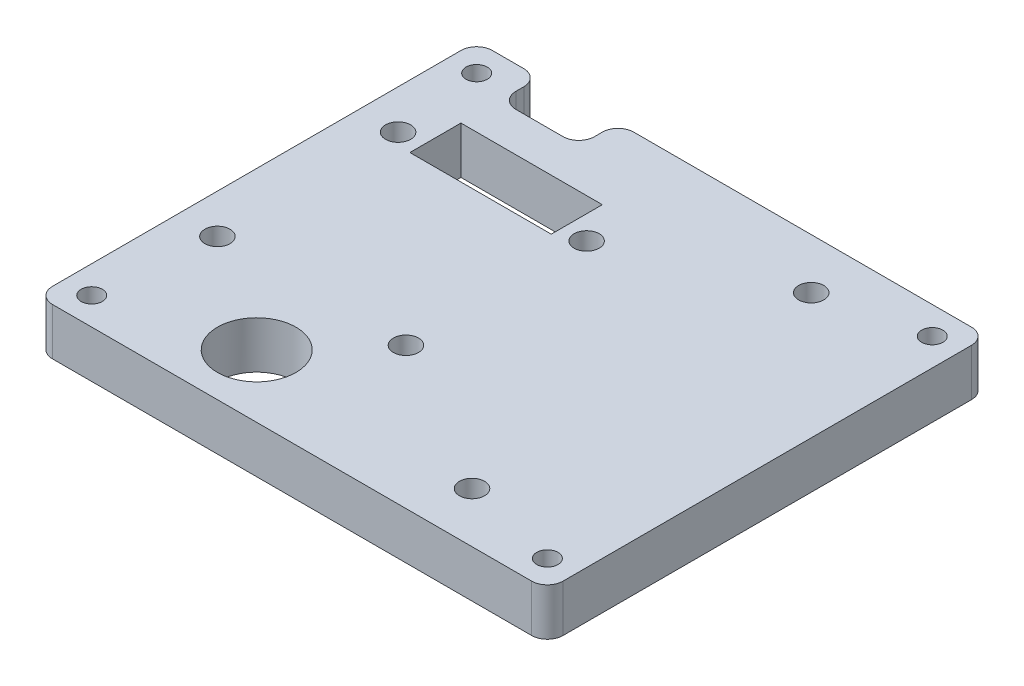
ISO-10303-21;
HEADER;
FILE_DESCRIPTION(('STEP AP214'),'2;1');
FILE_NAME('part.step','',(''),(''),'','','');
FILE_SCHEMA(('AUTOMOTIVE_DESIGN { 1 0 10303 214 1 1 1 1 }'));
ENDSEC;
DATA;
#1=APPLICATION_CONTEXT('core data for automotive mechanical design processes');
#2=APPLICATION_PROTOCOL_DEFINITION('international standard','automotive_design',2000,#1);
#3=PRODUCT_CONTEXT('',#1,'mechanical');
#4=PRODUCT('Part','Part','',(#3));
#5=PRODUCT_RELATED_PRODUCT_CATEGORY('part','',(#4));
#6=PRODUCT_DEFINITION_FORMATION('','',#4);
#7=PRODUCT_DEFINITION_CONTEXT('part definition',#1,'design');
#8=PRODUCT_DEFINITION('design','',#6,#7);
#9=PRODUCT_DEFINITION_SHAPE('','',#8);
#10=(LENGTH_UNIT() NAMED_UNIT(*) SI_UNIT(.MILLI.,.METRE.));
#11=(NAMED_UNIT(*) PLANE_ANGLE_UNIT() SI_UNIT($,.RADIAN.));
#12=(NAMED_UNIT(*) SI_UNIT($,.STERADIAN.) SOLID_ANGLE_UNIT());
#13=UNCERTAINTY_MEASURE_WITH_UNIT(LENGTH_MEASURE(1.E-05),#10,'distance_accuracy_value','');
#14=(GEOMETRIC_REPRESENTATION_CONTEXT(3) GLOBAL_UNCERTAINTY_ASSIGNED_CONTEXT((#13)) GLOBAL_UNIT_ASSIGNED_CONTEXT((#10,
#11,#12)) REPRESENTATION_CONTEXT('',''));
#15=CARTESIAN_POINT('',(0.,0.,0.));
#16=DIRECTION('',(0.,0.,1.));
#17=DIRECTION('',(1.,0.,0.));
#18=AXIS2_PLACEMENT_3D('',#15,#16,#17);
#19=CARTESIAN_POINT('',(-32.5,6.,-28.));
#20=DIRECTION('',(0.,0.,1.));
#21=DIRECTION('',(1.,0.,0.));
#22=AXIS2_PLACEMENT_3D('',#19,#20,#21);
#23=PLANE('',#22);
#24=DIRECTION('',(-1.,0.,0.));
#25=VECTOR('',#24,1.);
#26=CARTESIAN_POINT('',(-32.5,0.,-28.));
#27=LINE('',#26,#25);
#28=CARTESIAN_POINT('',(30.5,0.,-28.));
#29=VERTEX_POINT('',#28);
#30=CARTESIAN_POINT('',(-12.5,0.,-28.));
#31=VERTEX_POINT('',#30);
#32=EDGE_CURVE('E342',#29,#31,#27,.T.);
#33=ORIENTED_EDGE('',*,*,#32,.T.);
#34=DIRECTION('',(0.,1.,0.));
#35=VECTOR('',#34,1.);
#36=CARTESIAN_POINT('',(-12.5,6.,-28.));
#37=LINE('',#36,#35);
#38=CARTESIAN_POINT('',(-12.5,6.,-28.));
#39=VERTEX_POINT('',#38);
#40=EDGE_CURVE('E441',#31,#39,#37,.T.);
#41=ORIENTED_EDGE('',*,*,#40,.T.);
#42=DIRECTION('',(-1.,0.,0.));
#43=VECTOR('',#42,1.);
#44=CARTESIAN_POINT('',(-32.5,6.,-28.));
#45=LINE('',#44,#43);
#46=CARTESIAN_POINT('',(30.5,6.,-28.));
#47=VERTEX_POINT('',#46);
#48=EDGE_CURVE('E325',#47,#39,#45,.T.);
#49=ORIENTED_EDGE('',*,*,#48,.F.);
#50=DIRECTION('',(0.,-1.,0.));
#51=VECTOR('',#50,1.);
#52=CARTESIAN_POINT('',(30.5,6.,-28.));
#53=LINE('',#52,#51);
#54=EDGE_CURVE('E356',#47,#29,#53,.T.);
#55=ORIENTED_EDGE('',*,*,#54,.T.);
#56=EDGE_LOOP('',(#33,#41,#49,#55));
#57=FACE_BOUND('',#56,.T.);
#58=ADVANCED_FACE('F42',(#57),#23,.F.);
#59=CARTESIAN_POINT('',(32.5,6.,28.));
#60=DIRECTION('',(-1.,0.,0.));
#61=DIRECTION('',(0.,0.,1.));
#62=AXIS2_PLACEMENT_3D('',#59,#60,#61);
#63=PLANE('',#62);
#64=DIRECTION('',(0.,0.,-1.));
#65=VECTOR('',#64,1.);
#66=CARTESIAN_POINT('',(32.5,0.,28.));
#67=LINE('',#66,#65);
#68=CARTESIAN_POINT('',(32.5,0.,26.));
#69=VERTEX_POINT('',#68);
#70=CARTESIAN_POINT('',(32.5,0.,-26.));
#71=VERTEX_POINT('',#70);
#72=EDGE_CURVE('E318',#69,#71,#67,.T.);
#73=ORIENTED_EDGE('',*,*,#72,.T.);
#74=DIRECTION('',(0.,-1.,0.));
#75=VECTOR('',#74,1.);
#76=CARTESIAN_POINT('',(32.5,6.,-26.));
#77=LINE('',#76,#75);
#78=CARTESIAN_POINT('',(32.5,6.,-26.));
#79=VERTEX_POINT('',#78);
#80=EDGE_CURVE('E377',#71,#79,#77,.F.);
#81=ORIENTED_EDGE('',*,*,#80,.T.);
#82=DIRECTION('',(0.,0.,-1.));
#83=VECTOR('',#82,1.);
#84=CARTESIAN_POINT('',(32.5,6.,28.));
#85=LINE('',#84,#83);
#86=CARTESIAN_POINT('',(32.5,6.,26.));
#87=VERTEX_POINT('',#86);
#88=EDGE_CURVE('E319',#87,#79,#85,.T.);
#89=ORIENTED_EDGE('',*,*,#88,.F.);
#90=DIRECTION('',(0.,-1.,0.));
#91=VECTOR('',#90,1.);
#92=CARTESIAN_POINT('',(32.5,6.,26.));
#93=LINE('',#92,#91);
#94=EDGE_CURVE('E373',#87,#69,#93,.T.);
#95=ORIENTED_EDGE('',*,*,#94,.T.);
#96=EDGE_LOOP('',(#73,#81,#89,#95));
#97=FACE_BOUND('',#96,.T.);
#98=ADVANCED_FACE('F506',(#97),#63,.F.);
#99=CARTESIAN_POINT('',(-26.5,6.,-28.));
#100=VERTEX_POINT('',#99);
#101=CARTESIAN_POINT('',(-30.5,6.,-28.));
#102=VERTEX_POINT('',#101);
#103=EDGE_CURVE('E323',#100,#102,#45,.T.);
#104=ORIENTED_EDGE('',*,*,#103,.F.);
#105=DIRECTION('',(0.,1.,0.));
#106=VECTOR('',#105,1.);
#107=CARTESIAN_POINT('',(-26.5,6.,-28.));
#108=LINE('',#107,#106);
#109=CARTESIAN_POINT('',(-26.5,0.,-28.));
#110=VERTEX_POINT('',#109);
#111=EDGE_CURVE('E419',#100,#110,#108,.F.);
#112=ORIENTED_EDGE('',*,*,#111,.T.);
#113=CARTESIAN_POINT('',(-30.5,0.,-28.));
#114=VERTEX_POINT('',#113);
#115=EDGE_CURVE('E341',#110,#114,#27,.T.);
#116=ORIENTED_EDGE('',*,*,#115,.T.);
#117=DIRECTION('',(0.,-1.,0.));
#118=VECTOR('',#117,1.);
#119=CARTESIAN_POINT('',(-30.5,6.,-28.));
#120=LINE('',#119,#118);
#121=EDGE_CURVE('E337',#114,#102,#120,.F.);
#122=ORIENTED_EDGE('',*,*,#121,.T.);
#123=EDGE_LOOP('',(#104,#112,#116,#122));
#124=FACE_BOUND('',#123,.T.);
#125=ADVANCED_FACE('F509',(#124),#23,.F.);
#126=CARTESIAN_POINT('',(-32.5,6.,28.));
#127=DIRECTION('',(1.,0.,0.));
#128=DIRECTION('',(0.,0.,-1.));
#129=AXIS2_PLACEMENT_3D('',#126,#127,#128);
#130=PLANE('',#129);
#131=DIRECTION('',(0.,0.,1.));
#132=VECTOR('',#131,1.);
#133=CARTESIAN_POINT('',(-32.5,0.,28.));
#134=LINE('',#133,#132);
#135=CARTESIAN_POINT('',(-32.5,0.,-26.));
#136=VERTEX_POINT('',#135);
#137=CARTESIAN_POINT('',(-32.5,0.,26.));
#138=VERTEX_POINT('',#137);
#139=EDGE_CURVE('E346',#136,#138,#134,.T.);
#140=ORIENTED_EDGE('',*,*,#139,.T.);
#141=DIRECTION('',(0.,-1.,0.));
#142=VECTOR('',#141,1.);
#143=CARTESIAN_POINT('',(-32.5,6.,26.));
#144=LINE('',#143,#142);
#145=CARTESIAN_POINT('',(-32.5,6.,26.));
#146=VERTEX_POINT('',#145);
#147=EDGE_CURVE('E403',#138,#146,#144,.F.);
#148=ORIENTED_EDGE('',*,*,#147,.T.);
#149=DIRECTION('',(0.,0.,1.));
#150=VECTOR('',#149,1.);
#151=CARTESIAN_POINT('',(-32.5,6.,28.));
#152=LINE('',#151,#150);
#153=CARTESIAN_POINT('',(-32.5,6.,-26.));
#154=VERTEX_POINT('',#153);
#155=EDGE_CURVE('E329',#154,#146,#152,.T.);
#156=ORIENTED_EDGE('',*,*,#155,.F.);
#157=DIRECTION('',(0.,-1.,0.));
#158=VECTOR('',#157,1.);
#159=CARTESIAN_POINT('',(-32.5,6.,-26.));
#160=LINE('',#159,#158);
#161=EDGE_CURVE('E399',#154,#136,#160,.T.);
#162=ORIENTED_EDGE('',*,*,#161,.T.);
#163=EDGE_LOOP('',(#140,#148,#156,#162));
#164=FACE_BOUND('',#163,.T.);
#165=ADVANCED_FACE('F518',(#164),#130,.F.);
#166=CARTESIAN_POINT('',(-32.5,6.,28.));
#167=DIRECTION('',(0.,0.,-1.));
#168=DIRECTION('',(-1.,0.,0.));
#169=AXIS2_PLACEMENT_3D('',#166,#167,#168);
#170=PLANE('',#169);
#171=DIRECTION('',(1.,0.,0.));
#172=VECTOR('',#171,1.);
#173=CARTESIAN_POINT('',(-32.5,0.,28.));
#174=LINE('',#173,#172);
#175=CARTESIAN_POINT('',(-30.5,0.,28.));
#176=VERTEX_POINT('',#175);
#177=CARTESIAN_POINT('',(30.5,0.,28.));
#178=VERTEX_POINT('',#177);
#179=EDGE_CURVE('E324',#176,#178,#174,.T.);
#180=ORIENTED_EDGE('',*,*,#179,.T.);
#181=DIRECTION('',(0.,-1.,0.));
#182=VECTOR('',#181,1.);
#183=CARTESIAN_POINT('',(30.5,6.,28.));
#184=LINE('',#183,#182);
#185=CARTESIAN_POINT('',(30.5,6.,28.));
#186=VERTEX_POINT('',#185);
#187=EDGE_CURVE('E396',#178,#186,#184,.F.);
#188=ORIENTED_EDGE('',*,*,#187,.T.);
#189=DIRECTION('',(1.,0.,0.));
#190=VECTOR('',#189,1.);
#191=CARTESIAN_POINT('',(-32.5,6.,28.));
#192=LINE('',#191,#190);
#193=CARTESIAN_POINT('',(-30.5,6.,28.));
#194=VERTEX_POINT('',#193);
#195=EDGE_CURVE('E333',#194,#186,#192,.T.);
#196=ORIENTED_EDGE('',*,*,#195,.F.);
#197=DIRECTION('',(0.,-1.,0.));
#198=VECTOR('',#197,1.);
#199=CARTESIAN_POINT('',(-30.5,6.,28.));
#200=LINE('',#199,#198);
#201=EDGE_CURVE('E392',#194,#176,#200,.T.);
#202=ORIENTED_EDGE('',*,*,#201,.T.);
#203=EDGE_LOOP('',(#180,#188,#196,#202));
#204=FACE_BOUND('',#203,.T.);
#205=ADVANCED_FACE('F524',(#204),#170,.F.);
#206=CARTESIAN_POINT('',(0.,6.,0.));
#207=DIRECTION('',(0.,-1.,0.));
#208=DIRECTION('',(0.,0.,-1.));
#209=AXIS2_PLACEMENT_3D('',#206,#207,#208);
#210=PLANE('',#209);
#211=DIRECTION('',(0.,0.,1.));
#212=VECTOR('',#211,1.);
#213=CARTESIAN_POINT('',(-24.5,6.,-11.5));
#214=LINE('',#213,#212);
#215=CARTESIAN_POINT('',(-24.5,6.,-18.));
#216=VERTEX_POINT('',#215);
#217=CARTESIAN_POINT('',(-24.5,6.,-11.5));
#218=VERTEX_POINT('',#217);
#219=EDGE_CURVE('E210',#216,#218,#214,.T.);
#220=ORIENTED_EDGE('',*,*,#219,.F.);
#221=DIRECTION('',(-1.,0.,0.));
#222=VECTOR('',#221,1.);
#223=CARTESIAN_POINT('',(-24.5,6.,-18.));
#224=LINE('',#223,#222);
#225=CARTESIAN_POINT('',(-6.5,6.,-18.));
#226=VERTEX_POINT('',#225);
#227=EDGE_CURVE('E199',#226,#216,#224,.T.);
#228=ORIENTED_EDGE('',*,*,#227,.F.);
#229=DIRECTION('',(0.,0.,-1.));
#230=VECTOR('',#229,1.);
#231=CARTESIAN_POINT('',(-6.5,6.,-11.5));
#232=LINE('',#231,#230);
#233=CARTESIAN_POINT('',(-6.5,6.,-11.5));
#234=VERTEX_POINT('',#233);
#235=EDGE_CURVE('E214',#234,#226,#232,.T.);
#236=ORIENTED_EDGE('',*,*,#235,.F.);
#237=DIRECTION('',(1.,0.,0.));
#238=VECTOR('',#237,1.);
#239=CARTESIAN_POINT('',(-24.5,6.,-11.5));
#240=LINE('',#239,#238);
#241=EDGE_CURVE('E207',#218,#234,#240,.T.);
#242=ORIENTED_EDGE('',*,*,#241,.F.);
#243=EDGE_LOOP('',(#220,#228,#236,#242));
#244=FACE_BOUND('',#243,.T.);
#245=CARTESIAN_POINT('',(-12.5,6.,20.));
#246=DIRECTION('',(0.,1.,0.));
#247=DIRECTION('',(0.,0.,1.));
#248=AXIS2_PLACEMENT_3D('',#245,#246,#247);
#249=CIRCLE('',#248,5.);
#250=CARTESIAN_POINT('',(-12.5,6.,25.));
#251=VERTEX_POINT('',#250);
#252=EDGE_CURVE('E230',#251,#251,#249,.T.);
#253=ORIENTED_EDGE('',*,*,#252,.F.);
#254=EDGE_LOOP('',(#253));
#255=FACE_BOUND('',#254,.T.);
#256=CARTESIAN_POINT('',(16.5,6.,-21.59));
#257=DIRECTION('',(0.,1.,0.));
#258=DIRECTION('',(0.,0.,1.));
#259=AXIS2_PLACEMENT_3D('',#256,#257,#258);
#260=CIRCLE('',#259,1.6);
#261=CARTESIAN_POINT('',(16.5,6.,-19.99));
#262=VERTEX_POINT('',#261);
#263=EDGE_CURVE('E239',#262,#262,#260,.T.);
#264=ORIENTED_EDGE('',*,*,#263,.F.);
#265=EDGE_LOOP('',(#264));
#266=FACE_BOUND('',#265,.T.);
#267=CARTESIAN_POINT('',(16.5,6.,21.59));
#268=DIRECTION('',(0.,1.,0.));
#269=DIRECTION('',(0.,0.,-1.));
#270=AXIS2_PLACEMENT_3D('',#267,#268,#269);
#271=CIRCLE('',#270,1.6);
#272=CARTESIAN_POINT('',(16.5,6.,19.99));
#273=VERTEX_POINT('',#272);
#274=EDGE_CURVE('E244',#273,#273,#271,.T.);
#275=ORIENTED_EDGE('',*,*,#274,.F.);
#276=EDGE_LOOP('',(#275));
#277=FACE_BOUND('',#276,.T.);
#278=CARTESIAN_POINT('',(-3.5,6.,-13.));
#279=DIRECTION('',(0.,1.,0.));
#280=DIRECTION('',(0.,0.,-1.));
#281=AXIS2_PLACEMENT_3D('',#278,#279,#280);
#282=CIRCLE('',#281,1.6);
#283=CARTESIAN_POINT('',(-3.5,6.,-14.6));
#284=VERTEX_POINT('',#283);
#285=EDGE_CURVE('E267',#284,#284,#282,.T.);
#286=ORIENTED_EDGE('',*,*,#285,.F.);
#287=EDGE_LOOP('',(#286));
#288=FACE_BOUND('',#287,.T.);
#289=CARTESIAN_POINT('',(-27.5,6.,10.));
#290=DIRECTION('',(0.,1.,0.));
#291=DIRECTION('',(0.,0.,1.));
#292=AXIS2_PLACEMENT_3D('',#289,#290,#291);
#293=CIRCLE('',#292,1.6);
#294=CARTESIAN_POINT('',(-27.5,6.,11.6));
#295=VERTEX_POINT('',#294);
#296=EDGE_CURVE('E268',#295,#295,#293,.T.);
#297=ORIENTED_EDGE('',*,*,#296,.F.);
#298=EDGE_LOOP('',(#297));
#299=FACE_BOUND('',#298,.T.);
#300=CARTESIAN_POINT('',(-3.5,6.,10.));
#301=DIRECTION('',(0.,1.,0.));
#302=DIRECTION('',(0.,0.,-1.));
#303=AXIS2_PLACEMENT_3D('',#300,#301,#302);
#304=CIRCLE('',#303,1.6);
#305=CARTESIAN_POINT('',(-3.5,6.,8.4));
#306=VERTEX_POINT('',#305);
#307=EDGE_CURVE('E258',#306,#306,#304,.T.);
#308=ORIENTED_EDGE('',*,*,#307,.F.);
#309=EDGE_LOOP('',(#308));
#310=FACE_BOUND('',#309,.T.);
#311=CARTESIAN_POINT('',(-27.5,6.,-13.));
#312=DIRECTION('',(0.,1.,0.));
#313=DIRECTION('',(0.,0.,1.));
#314=AXIS2_PLACEMENT_3D('',#311,#312,#313);
#315=CIRCLE('',#314,1.6);
#316=CARTESIAN_POINT('',(-27.5,6.,-11.4));
#317=VERTEX_POINT('',#316);
#318=EDGE_CURVE('E272',#317,#317,#315,.T.);
#319=ORIENTED_EDGE('',*,*,#318,.F.);
#320=EDGE_LOOP('',(#319));
#321=FACE_BOUND('',#320,.T.);
#322=CARTESIAN_POINT('',(-29.,6.,24.5));
#323=DIRECTION('',(0.,1.,0.));
#324=DIRECTION('',(0.,0.,-1.));
#325=AXIS2_PLACEMENT_3D('',#322,#323,#324);
#326=CIRCLE('',#325,1.35000000000001);
#327=CARTESIAN_POINT('',(-29.,6.,23.15));
#328=VERTEX_POINT('',#327);
#329=EDGE_CURVE('E301',#328,#328,#326,.T.);
#330=ORIENTED_EDGE('',*,*,#329,.F.);
#331=EDGE_LOOP('',(#330));
#332=FACE_BOUND('',#331,.T.);
#333=CARTESIAN_POINT('',(29.,6.,24.5));
#334=DIRECTION('',(0.,1.,0.));
#335=DIRECTION('',(0.,0.,1.));
#336=AXIS2_PLACEMENT_3D('',#333,#334,#335);
#337=CIRCLE('',#336,1.35);
#338=CARTESIAN_POINT('',(29.,6.,25.85));
#339=VERTEX_POINT('',#338);
#340=EDGE_CURVE('E292',#339,#339,#337,.T.);
#341=ORIENTED_EDGE('',*,*,#340,.F.);
#342=EDGE_LOOP('',(#341));
#343=FACE_BOUND('',#342,.T.);
#344=CARTESIAN_POINT('',(29.,6.,-24.5));
#345=DIRECTION('',(0.,1.,0.));
#346=DIRECTION('',(0.,0.,-1.));
#347=AXIS2_PLACEMENT_3D('',#344,#345,#346);
#348=CIRCLE('',#347,1.35);
#349=CARTESIAN_POINT('',(29.,6.,-25.85));
#350=VERTEX_POINT('',#349);
#351=EDGE_CURVE('E291',#350,#350,#348,.T.);
#352=ORIENTED_EDGE('',*,*,#351,.F.);
#353=EDGE_LOOP('',(#352));
#354=FACE_BOUND('',#353,.T.);
#355=CARTESIAN_POINT('',(-29.,6.,-24.5));
#356=DIRECTION('',(0.,1.,0.));
#357=DIRECTION('',(0.,0.,1.));
#358=AXIS2_PLACEMENT_3D('',#355,#356,#357);
#359=CIRCLE('',#358,1.35);
#360=CARTESIAN_POINT('',(-29.,6.,-23.15));
#361=VERTEX_POINT('',#360);
#362=EDGE_CURVE('E296',#361,#361,#359,.T.);
#363=ORIENTED_EDGE('',*,*,#362,.F.);
#364=EDGE_LOOP('',(#363));
#365=FACE_BOUND('',#364,.T.);
#366=DIRECTION('',(0.,0.,1.));
#367=VECTOR('',#366,1.);
#368=CARTESIAN_POINT('',(-24.5,6.,-28.));
#369=LINE('',#368,#367);
#370=CARTESIAN_POINT('',(-24.5,6.,-26.));
#371=VERTEX_POINT('',#370);
#372=CARTESIAN_POINT('',(-24.5,6.,-25.));
#373=VERTEX_POINT('',#372);
#374=EDGE_CURVE('E463',#371,#373,#369,.T.);
#375=ORIENTED_EDGE('',*,*,#374,.F.);
#376=CARTESIAN_POINT('',(-26.5,6.,-26.));
#377=DIRECTION('',(0.,-1.,0.));
#378=DIRECTION('',(0.,0.,-1.));
#379=AXIS2_PLACEMENT_3D('',#376,#377,#378);
#380=CIRCLE('',#379,2.);
#381=EDGE_CURVE('E416',#371,#100,#380,.F.);
#382=ORIENTED_EDGE('',*,*,#381,.T.);
#383=ORIENTED_EDGE('',*,*,#103,.T.);
#384=CARTESIAN_POINT('',(-30.5,6.,-26.));
#385=DIRECTION('',(0.,-1.,0.));
#386=DIRECTION('',(0.,0.,-1.));
#387=AXIS2_PLACEMENT_3D('',#384,#385,#386);
#388=CIRCLE('',#387,2.);
#389=EDGE_CURVE('E380',#102,#154,#388,.F.);
#390=ORIENTED_EDGE('',*,*,#389,.T.);
#391=ORIENTED_EDGE('',*,*,#155,.T.);
#392=CARTESIAN_POINT('',(-30.5,6.,26.));
#393=DIRECTION('',(0.,-1.,0.));
#394=DIRECTION('',(0.,0.,-1.));
#395=AXIS2_PLACEMENT_3D('',#392,#393,#394);
#396=CIRCLE('',#395,2.);
#397=EDGE_CURVE('E383',#146,#194,#396,.F.);
#398=ORIENTED_EDGE('',*,*,#397,.T.);
#399=ORIENTED_EDGE('',*,*,#195,.T.);
#400=CARTESIAN_POINT('',(30.5,6.,26.));
#401=DIRECTION('',(0.,-1.,0.));
#402=DIRECTION('',(0.,0.,-1.));
#403=AXIS2_PLACEMENT_3D('',#400,#401,#402);
#404=CIRCLE('',#403,2.);
#405=EDGE_CURVE('E386',#186,#87,#404,.F.);
#406=ORIENTED_EDGE('',*,*,#405,.T.);
#407=ORIENTED_EDGE('',*,*,#88,.T.);
#408=CARTESIAN_POINT('',(30.5,6.,-26.));
#409=DIRECTION('',(0.,-1.,0.));
#410=DIRECTION('',(0.,0.,-1.));
#411=AXIS2_PLACEMENT_3D('',#408,#409,#410);
#412=CIRCLE('',#411,2.);
#413=EDGE_CURVE('E389',#79,#47,#412,.F.);
#414=ORIENTED_EDGE('',*,*,#413,.T.);
#415=ORIENTED_EDGE('',*,*,#48,.T.);
#416=CARTESIAN_POINT('',(-12.5,6.,-26.));
#417=DIRECTION('',(0.,-1.,0.));
#418=DIRECTION('',(0.,0.,-1.));
#419=AXIS2_PLACEMENT_3D('',#416,#417,#418);
#420=CIRCLE('',#419,2.);
#421=CARTESIAN_POINT('',(-14.5,6.,-26.));
#422=VERTEX_POINT('',#421);
#423=EDGE_CURVE('E413',#39,#422,#420,.F.);
#424=ORIENTED_EDGE('',*,*,#423,.T.);
#425=DIRECTION('',(0.,0.,-1.));
#426=VECTOR('',#425,1.);
#427=CARTESIAN_POINT('',(-14.5,6.,-28.));
#428=LINE('',#427,#426);
#429=CARTESIAN_POINT('',(-14.5,6.,-25.));
#430=VERTEX_POINT('',#429);
#431=EDGE_CURVE('E457',#430,#422,#428,.T.);
#432=ORIENTED_EDGE('',*,*,#431,.F.);
#433=CARTESIAN_POINT('',(-16.5,6.,-25.));
#434=DIRECTION('',(0.,-1.,0.));
#435=DIRECTION('',(0.,0.,-1.));
#436=AXIS2_PLACEMENT_3D('',#433,#434,#435);
#437=CIRCLE('',#436,2.);
#438=CARTESIAN_POINT('',(-16.5,6.,-23.));
#439=VERTEX_POINT('',#438);
#440=EDGE_CURVE('E51',#430,#439,#437,.T.);
#441=ORIENTED_EDGE('',*,*,#440,.T.);
#442=DIRECTION('',(1.,0.,0.));
#443=VECTOR('',#442,1.);
#444=CARTESIAN_POINT('',(-24.5,6.,-23.));
#445=LINE('',#444,#443);
#446=CARTESIAN_POINT('',(-22.5,6.,-23.));
#447=VERTEX_POINT('',#446);
#448=EDGE_CURVE('E455',#447,#439,#445,.T.);
#449=ORIENTED_EDGE('',*,*,#448,.F.);
#450=CARTESIAN_POINT('',(-22.5,6.,-25.));
#451=DIRECTION('',(0.,-1.,0.));
#452=DIRECTION('',(0.,0.,-1.));
#453=AXIS2_PLACEMENT_3D('',#450,#451,#452);
#454=CIRCLE('',#453,2.);
#455=EDGE_CURVE('E445',#447,#373,#454,.T.);
#456=ORIENTED_EDGE('',*,*,#455,.T.);
#457=EDGE_LOOP('',(#375,#382,#383,#390,#391,#398,#399,#406,#407,#414,#415,#424,#432,#441,#449,#456));
#458=FACE_BOUND('',#457,.T.);
#459=ADVANCED_FACE('F454',(#244,#255,#266,#277,#288,#299,#310,#321,#332,#343,#354,#365,#458),
#210,.F.);
#460=CARTESIAN_POINT('',(0.,0.,0.));
#461=DIRECTION('',(0.,-1.,0.));
#462=DIRECTION('',(0.,0.,-1.));
#463=AXIS2_PLACEMENT_3D('',#460,#461,#462);
#464=PLANE('',#463);
#465=ORIENTED_EDGE('',*,*,#115,.F.);
#466=CARTESIAN_POINT('',(-26.5,0.,-26.));
#467=DIRECTION('',(0.,-1.,0.));
#468=DIRECTION('',(0.,0.,-1.));
#469=AXIS2_PLACEMENT_3D('',#466,#467,#468);
#470=CIRCLE('',#469,2.);
#471=CARTESIAN_POINT('',(-24.5,0.,-26.));
#472=VERTEX_POINT('',#471);
#473=EDGE_CURVE('E425',#110,#472,#470,.T.);
#474=ORIENTED_EDGE('',*,*,#473,.T.);
#475=DIRECTION('',(0.,0.,1.));
#476=VECTOR('',#475,1.);
#477=CARTESIAN_POINT('',(-24.5,0.,-28.));
#478=LINE('',#477,#476);
#479=CARTESIAN_POINT('',(-24.5,0.,-25.));
#480=VERTEX_POINT('',#479);
#481=EDGE_CURVE('E477',#472,#480,#478,.T.);
#482=ORIENTED_EDGE('',*,*,#481,.T.);
#483=CARTESIAN_POINT('',(-22.5,0.,-25.));
#484=DIRECTION('',(0.,-1.,0.));
#485=DIRECTION('',(0.,0.,-1.));
#486=AXIS2_PLACEMENT_3D('',#483,#484,#485);
#487=CIRCLE('',#486,2.);
#488=CARTESIAN_POINT('',(-22.5,0.,-23.));
#489=VERTEX_POINT('',#488);
#490=EDGE_CURVE('E65',#480,#489,#487,.F.);
#491=ORIENTED_EDGE('',*,*,#490,.T.);
#492=DIRECTION('',(1.,0.,0.));
#493=VECTOR('',#492,1.);
#494=CARTESIAN_POINT('',(-24.5,0.,-23.));
#495=LINE('',#494,#493);
#496=CARTESIAN_POINT('',(-16.5,0.,-23.));
#497=VERTEX_POINT('',#496);
#498=EDGE_CURVE('E472',#489,#497,#495,.T.);
#499=ORIENTED_EDGE('',*,*,#498,.T.);
#500=CARTESIAN_POINT('',(-16.5,0.,-25.));
#501=DIRECTION('',(0.,-1.,0.));
#502=DIRECTION('',(0.,0.,-1.));
#503=AXIS2_PLACEMENT_3D('',#500,#501,#502);
#504=CIRCLE('',#503,2.);
#505=CARTESIAN_POINT('',(-14.5,0.,-25.));
#506=VERTEX_POINT('',#505);
#507=EDGE_CURVE('E11',#497,#506,#504,.F.);
#508=ORIENTED_EDGE('',*,*,#507,.T.);
#509=DIRECTION('',(0.,0.,-1.));
#510=VECTOR('',#509,1.);
#511=CARTESIAN_POINT('',(-14.5,0.,-28.));
#512=LINE('',#511,#510);
#513=CARTESIAN_POINT('',(-14.5,0.,-26.));
#514=VERTEX_POINT('',#513);
#515=EDGE_CURVE('E470',#506,#514,#512,.T.);
#516=ORIENTED_EDGE('',*,*,#515,.T.);
#517=CARTESIAN_POINT('',(-12.5,0.,-26.));
#518=DIRECTION('',(0.,-1.,0.));
#519=DIRECTION('',(0.,0.,-1.));
#520=AXIS2_PLACEMENT_3D('',#517,#518,#519);
#521=CIRCLE('',#520,2.);
#522=EDGE_CURVE('E422',#514,#31,#521,.T.);
#523=ORIENTED_EDGE('',*,*,#522,.T.);
#524=ORIENTED_EDGE('',*,*,#32,.F.);
#525=CARTESIAN_POINT('',(30.5,0.,-26.));
#526=DIRECTION('',(0.,-1.,0.));
#527=DIRECTION('',(0.,0.,-1.));
#528=AXIS2_PLACEMENT_3D('',#525,#526,#527);
#529=CIRCLE('',#528,2.);
#530=EDGE_CURVE('E370',#29,#71,#529,.T.);
#531=ORIENTED_EDGE('',*,*,#530,.T.);
#532=ORIENTED_EDGE('',*,*,#72,.F.);
#533=CARTESIAN_POINT('',(30.5,0.,26.));
#534=DIRECTION('',(0.,-1.,0.));
#535=DIRECTION('',(0.,0.,-1.));
#536=AXIS2_PLACEMENT_3D('',#533,#534,#535);
#537=CIRCLE('',#536,2.);
#538=EDGE_CURVE('E367',#69,#178,#537,.T.);
#539=ORIENTED_EDGE('',*,*,#538,.T.);
#540=ORIENTED_EDGE('',*,*,#179,.F.);
#541=CARTESIAN_POINT('',(-30.5,0.,26.));
#542=DIRECTION('',(0.,-1.,0.));
#543=DIRECTION('',(0.,0.,-1.));
#544=AXIS2_PLACEMENT_3D('',#541,#542,#543);
#545=CIRCLE('',#544,2.);
#546=EDGE_CURVE('E364',#176,#138,#545,.T.);
#547=ORIENTED_EDGE('',*,*,#546,.T.);
#548=ORIENTED_EDGE('',*,*,#139,.F.);
#549=CARTESIAN_POINT('',(-30.5,0.,-26.));
#550=DIRECTION('',(0.,-1.,0.));
#551=DIRECTION('',(0.,0.,-1.));
#552=AXIS2_PLACEMENT_3D('',#549,#550,#551);
#553=CIRCLE('',#552,2.);
#554=EDGE_CURVE('E360',#136,#114,#553,.T.);
#555=ORIENTED_EDGE('',*,*,#554,.T.);
#556=EDGE_LOOP('',(#465,#474,#482,#491,#499,#508,#516,#523,#524,#531,#532,#539,#540,#547,#548,#555));
#557=FACE_BOUND('',#556,.T.);
#558=DIRECTION('',(-1.,0.,0.));
#559=VECTOR('',#558,1.);
#560=CARTESIAN_POINT('',(-24.5,0.,-18.));
#561=LINE('',#560,#559);
#562=CARTESIAN_POINT('',(-6.5,0.,-18.));
#563=VERTEX_POINT('',#562);
#564=CARTESIAN_POINT('',(-24.5,0.,-18.));
#565=VERTEX_POINT('',#564);
#566=EDGE_CURVE('E196',#563,#565,#561,.T.);
#567=ORIENTED_EDGE('',*,*,#566,.T.);
#568=DIRECTION('',(0.,0.,1.));
#569=VECTOR('',#568,1.);
#570=CARTESIAN_POINT('',(-24.5,0.,-11.5));
#571=LINE('',#570,#569);
#572=CARTESIAN_POINT('',(-24.5,0.,-11.5));
#573=VERTEX_POINT('',#572);
#574=EDGE_CURVE('E181',#565,#573,#571,.T.);
#575=ORIENTED_EDGE('',*,*,#574,.T.);
#576=DIRECTION('',(1.,0.,0.));
#577=VECTOR('',#576,1.);
#578=CARTESIAN_POINT('',(-24.5,0.,-11.5));
#579=LINE('',#578,#577);
#580=CARTESIAN_POINT('',(-6.5,0.,-11.5));
#581=VERTEX_POINT('',#580);
#582=EDGE_CURVE('E220',#573,#581,#579,.T.);
#583=ORIENTED_EDGE('',*,*,#582,.T.);
#584=DIRECTION('',(0.,0.,-1.));
#585=VECTOR('',#584,1.);
#586=CARTESIAN_POINT('',(-6.5,0.,-11.5));
#587=LINE('',#586,#585);
#588=EDGE_CURVE('E205',#581,#563,#587,.T.);
#589=ORIENTED_EDGE('',*,*,#588,.T.);
#590=EDGE_LOOP('',(#567,#575,#583,#589));
#591=FACE_BOUND('',#590,.T.);
#592=CARTESIAN_POINT('',(-12.5,0.,20.));
#593=DIRECTION('',(0.,-1.,0.));
#594=DIRECTION('',(0.,0.,-1.));
#595=AXIS2_PLACEMENT_3D('',#592,#593,#594);
#596=CIRCLE('',#595,5.);
#597=CARTESIAN_POINT('',(-12.5,0.,15.));
#598=VERTEX_POINT('',#597);
#599=EDGE_CURVE('E234',#598,#598,#596,.F.);
#600=ORIENTED_EDGE('',*,*,#599,.T.);
#601=EDGE_LOOP('',(#600));
#602=FACE_BOUND('',#601,.T.);
#603=CARTESIAN_POINT('',(16.5,0.,-21.59));
#604=DIRECTION('',(0.,-1.,0.));
#605=DIRECTION('',(0.,0.,-1.));
#606=AXIS2_PLACEMENT_3D('',#603,#604,#605);
#607=CIRCLE('',#606,1.6);
#608=CARTESIAN_POINT('',(16.5,0.,-23.19));
#609=VERTEX_POINT('',#608);
#610=EDGE_CURVE('E243',#609,#609,#607,.F.);
#611=ORIENTED_EDGE('',*,*,#610,.T.);
#612=EDGE_LOOP('',(#611));
#613=FACE_BOUND('',#612,.T.);
#614=CARTESIAN_POINT('',(16.5,0.,21.59));
#615=DIRECTION('',(0.,-1.,0.));
#616=DIRECTION('',(0.,0.,-1.));
#617=AXIS2_PLACEMENT_3D('',#614,#615,#616);
#618=CIRCLE('',#617,1.6);
#619=CARTESIAN_POINT('',(16.5,0.,19.99));
#620=VERTEX_POINT('',#619);
#621=EDGE_CURVE('E238',#620,#620,#618,.F.);
#622=ORIENTED_EDGE('',*,*,#621,.T.);
#623=EDGE_LOOP('',(#622));
#624=FACE_BOUND('',#623,.T.);
#625=CARTESIAN_POINT('',(-3.5,0.,-13.));
#626=DIRECTION('',(0.,-1.,0.));
#627=DIRECTION('',(0.,0.,-1.));
#628=AXIS2_PLACEMENT_3D('',#625,#626,#627);
#629=CIRCLE('',#628,1.6);
#630=CARTESIAN_POINT('',(-3.5,0.,-14.6));
#631=VERTEX_POINT('',#630);
#632=EDGE_CURVE('E263',#631,#631,#629,.F.);
#633=ORIENTED_EDGE('',*,*,#632,.T.);
#634=EDGE_LOOP('',(#633));
#635=FACE_BOUND('',#634,.T.);
#636=CARTESIAN_POINT('',(-27.5,0.,10.));
#637=DIRECTION('',(0.,-1.,0.));
#638=DIRECTION('',(0.,0.,-1.));
#639=AXIS2_PLACEMENT_3D('',#636,#637,#638);
#640=CIRCLE('',#639,1.6);
#641=CARTESIAN_POINT('',(-27.5,0.,8.4));
#642=VERTEX_POINT('',#641);
#643=EDGE_CURVE('E262',#642,#642,#640,.F.);
#644=ORIENTED_EDGE('',*,*,#643,.T.);
#645=EDGE_LOOP('',(#644));
#646=FACE_BOUND('',#645,.T.);
#647=CARTESIAN_POINT('',(-3.5,0.,10.));
#648=DIRECTION('',(0.,-1.,0.));
#649=DIRECTION('',(0.,0.,-1.));
#650=AXIS2_PLACEMENT_3D('',#647,#648,#649);
#651=CIRCLE('',#650,1.6);
#652=CARTESIAN_POINT('',(-3.5,0.,8.4));
#653=VERTEX_POINT('',#652);
#654=EDGE_CURVE('E248',#653,#653,#651,.F.);
#655=ORIENTED_EDGE('',*,*,#654,.T.);
#656=EDGE_LOOP('',(#655));
#657=FACE_BOUND('',#656,.T.);
#658=CARTESIAN_POINT('',(-27.5,0.,-13.));
#659=DIRECTION('',(0.,-1.,0.));
#660=DIRECTION('',(0.,0.,-1.));
#661=AXIS2_PLACEMENT_3D('',#658,#659,#660);
#662=CIRCLE('',#661,1.6);
#663=CARTESIAN_POINT('',(-27.5,0.,-14.6));
#664=VERTEX_POINT('',#663);
#665=EDGE_CURVE('E282',#664,#664,#662,.F.);
#666=ORIENTED_EDGE('',*,*,#665,.T.);
#667=EDGE_LOOP('',(#666));
#668=FACE_BOUND('',#667,.T.);
#669=CARTESIAN_POINT('',(-29.,0.,24.5));
#670=DIRECTION('',(0.,-1.,0.));
#671=DIRECTION('',(0.,0.,-1.));
#672=AXIS2_PLACEMENT_3D('',#669,#670,#671);
#673=CIRCLE('',#672,1.35000000000001);
#674=CARTESIAN_POINT('',(-29.,0.,23.15));
#675=VERTEX_POINT('',#674);
#676=EDGE_CURVE('E286',#675,#675,#673,.F.);
#677=ORIENTED_EDGE('',*,*,#676,.T.);
#678=EDGE_LOOP('',(#677));
#679=FACE_BOUND('',#678,.T.);
#680=CARTESIAN_POINT('',(29.,0.,24.5));
#681=DIRECTION('',(0.,-1.,0.));
#682=DIRECTION('',(0.,0.,-1.));
#683=AXIS2_PLACEMENT_3D('',#680,#681,#682);
#684=CIRCLE('',#683,1.35);
#685=CARTESIAN_POINT('',(29.,0.,23.15));
#686=VERTEX_POINT('',#685);
#687=EDGE_CURVE('E297',#686,#686,#684,.F.);
#688=ORIENTED_EDGE('',*,*,#687,.T.);
#689=EDGE_LOOP('',(#688));
#690=FACE_BOUND('',#689,.T.);
#691=CARTESIAN_POINT('',(29.,0.,-24.5));
#692=DIRECTION('',(0.,-1.,0.));
#693=DIRECTION('',(0.,0.,-1.));
#694=AXIS2_PLACEMENT_3D('',#691,#692,#693);
#695=CIRCLE('',#694,1.35);
#696=CARTESIAN_POINT('',(29.,0.,-25.85));
#697=VERTEX_POINT('',#696);
#698=EDGE_CURVE('E287',#697,#697,#695,.F.);
#699=ORIENTED_EDGE('',*,*,#698,.T.);
#700=EDGE_LOOP('',(#699));
#701=FACE_BOUND('',#700,.T.);
#702=CARTESIAN_POINT('',(-29.,0.,-24.5));
#703=DIRECTION('',(0.,-1.,0.));
#704=DIRECTION('',(0.,0.,-1.));
#705=AXIS2_PLACEMENT_3D('',#702,#703,#704);
#706=CIRCLE('',#705,1.35);
#707=CARTESIAN_POINT('',(-29.,0.,-25.85));
#708=VERTEX_POINT('',#707);
#709=EDGE_CURVE('E314',#708,#708,#706,.F.);
#710=ORIENTED_EDGE('',*,*,#709,.T.);
#711=EDGE_LOOP('',(#710));
#712=FACE_BOUND('',#711,.T.);
#713=ADVANCED_FACE('F203',(#557,#591,#602,#613,#624,#635,#646,#657,#668,#679,#690,#701,#712),
#464,.T.);
#714=CARTESIAN_POINT('',(-29.,-3.81837661840737,-24.5));
#715=DIRECTION('',(0.,1.,0.));
#716=DIRECTION('',(0.,0.,1.));
#717=AXIS2_PLACEMENT_3D('',#714,#715,#716);
#718=CYLINDRICAL_SURFACE('',#717,1.35);
#719=ORIENTED_EDGE('',*,*,#362,.T.);
#720=EDGE_LOOP('',(#719));
#721=FACE_BOUND('',#720,.T.);
#722=ORIENTED_EDGE('',*,*,#709,.F.);
#723=EDGE_LOOP('',(#722));
#724=FACE_BOUND('',#723,.T.);
#725=ADVANCED_FACE('F653',(#721,#724),#718,.F.);
#726=CARTESIAN_POINT('',(29.,-3.81837661840737,-24.5));
#727=DIRECTION('',(0.,1.,0.));
#728=DIRECTION('',(0.,0.,1.));
#729=AXIS2_PLACEMENT_3D('',#726,#727,#728);
#730=CYLINDRICAL_SURFACE('',#729,1.35);
#731=ORIENTED_EDGE('',*,*,#351,.T.);
#732=EDGE_LOOP('',(#731));
#733=FACE_BOUND('',#732,.T.);
#734=ORIENTED_EDGE('',*,*,#698,.F.);
#735=EDGE_LOOP('',(#734));
#736=FACE_BOUND('',#735,.T.);
#737=ADVANCED_FACE('F708',(#733,#736),#730,.F.);
#738=CARTESIAN_POINT('',(29.,-3.81837661840737,24.5));
#739=DIRECTION('',(0.,1.,0.));
#740=DIRECTION('',(0.,0.,1.));
#741=AXIS2_PLACEMENT_3D('',#738,#739,#740);
#742=CYLINDRICAL_SURFACE('',#741,1.35);
#743=ORIENTED_EDGE('',*,*,#340,.T.);
#744=EDGE_LOOP('',(#743));
#745=FACE_BOUND('',#744,.T.);
#746=ORIENTED_EDGE('',*,*,#687,.F.);
#747=EDGE_LOOP('',(#746));
#748=FACE_BOUND('',#747,.T.);
#749=ADVANCED_FACE('F695',(#745,#748),#742,.F.);
#750=CARTESIAN_POINT('',(-29.,-3.81837661840737,24.5));
#751=DIRECTION('',(0.,1.,0.));
#752=DIRECTION('',(0.,0.,1.));
#753=AXIS2_PLACEMENT_3D('',#750,#751,#752);
#754=CYLINDRICAL_SURFACE('',#753,1.35000000000001);
#755=ORIENTED_EDGE('',*,*,#329,.T.);
#756=EDGE_LOOP('',(#755));
#757=FACE_BOUND('',#756,.T.);
#758=ORIENTED_EDGE('',*,*,#676,.F.);
#759=EDGE_LOOP('',(#758));
#760=FACE_BOUND('',#759,.T.);
#761=ADVANCED_FACE('F690',(#757,#760),#754,.F.);
#762=CARTESIAN_POINT('',(30.5,6.,-26.));
#763=DIRECTION('',(0.,-1.,0.));
#764=DIRECTION('',(0.,0.,-1.));
#765=AXIS2_PLACEMENT_3D('',#762,#763,#764);
#766=CYLINDRICAL_SURFACE('',#765,2.);
#767=ORIENTED_EDGE('',*,*,#413,.F.);
#768=ORIENTED_EDGE('',*,*,#80,.F.);
#769=ORIENTED_EDGE('',*,*,#530,.F.);
#770=ORIENTED_EDGE('',*,*,#54,.F.);
#771=EDGE_LOOP('',(#767,#768,#769,#770));
#772=FACE_BOUND('',#771,.T.);
#773=ADVANCED_FACE('F553',(#772),#766,.T.);
#774=CARTESIAN_POINT('',(30.5,6.,26.));
#775=DIRECTION('',(0.,-1.,0.));
#776=DIRECTION('',(0.,0.,-1.));
#777=AXIS2_PLACEMENT_3D('',#774,#775,#776);
#778=CYLINDRICAL_SURFACE('',#777,2.);
#779=ORIENTED_EDGE('',*,*,#405,.F.);
#780=ORIENTED_EDGE('',*,*,#187,.F.);
#781=ORIENTED_EDGE('',*,*,#538,.F.);
#782=ORIENTED_EDGE('',*,*,#94,.F.);
#783=EDGE_LOOP('',(#779,#780,#781,#782));
#784=FACE_BOUND('',#783,.T.);
#785=ADVANCED_FACE('F560',(#784),#778,.T.);
#786=CARTESIAN_POINT('',(-30.5,6.,26.));
#787=DIRECTION('',(0.,-1.,0.));
#788=DIRECTION('',(0.,0.,-1.));
#789=AXIS2_PLACEMENT_3D('',#786,#787,#788);
#790=CYLINDRICAL_SURFACE('',#789,2.);
#791=ORIENTED_EDGE('',*,*,#397,.F.);
#792=ORIENTED_EDGE('',*,*,#147,.F.);
#793=ORIENTED_EDGE('',*,*,#546,.F.);
#794=ORIENTED_EDGE('',*,*,#201,.F.);
#795=EDGE_LOOP('',(#791,#792,#793,#794));
#796=FACE_BOUND('',#795,.T.);
#797=ADVANCED_FACE('F568',(#796),#790,.T.);
#798=CARTESIAN_POINT('',(-30.5,6.,-26.));
#799=DIRECTION('',(0.,-1.,0.));
#800=DIRECTION('',(0.,0.,-1.));
#801=AXIS2_PLACEMENT_3D('',#798,#799,#800);
#802=CYLINDRICAL_SURFACE('',#801,2.);
#803=ORIENTED_EDGE('',*,*,#389,.F.);
#804=ORIENTED_EDGE('',*,*,#121,.F.);
#805=ORIENTED_EDGE('',*,*,#554,.F.);
#806=ORIENTED_EDGE('',*,*,#161,.F.);
#807=EDGE_LOOP('',(#803,#804,#805,#806));
#808=FACE_BOUND('',#807,.T.);
#809=ADVANCED_FACE('F574',(#808),#802,.T.);
#810=CARTESIAN_POINT('',(-27.5,-4.52548339959391,-13.));
#811=DIRECTION('',(0.,1.,0.));
#812=DIRECTION('',(0.,0.,1.));
#813=AXIS2_PLACEMENT_3D('',#810,#811,#812);
#814=CYLINDRICAL_SURFACE('',#813,1.6);
#815=ORIENTED_EDGE('',*,*,#318,.T.);
#816=EDGE_LOOP('',(#815));
#817=FACE_BOUND('',#816,.T.);
#818=ORIENTED_EDGE('',*,*,#665,.F.);
#819=EDGE_LOOP('',(#818));
#820=FACE_BOUND('',#819,.T.);
#821=ADVANCED_FACE('F576',(#817,#820),#814,.F.);
#822=CARTESIAN_POINT('',(-3.5,-4.52548339959391,10.));
#823=DIRECTION('',(0.,1.,0.));
#824=DIRECTION('',(0.,0.,1.));
#825=AXIS2_PLACEMENT_3D('',#822,#823,#824);
#826=CYLINDRICAL_SURFACE('',#825,1.6);
#827=ORIENTED_EDGE('',*,*,#307,.T.);
#828=EDGE_LOOP('',(#827));
#829=FACE_BOUND('',#828,.T.);
#830=ORIENTED_EDGE('',*,*,#654,.F.);
#831=EDGE_LOOP('',(#830));
#832=FACE_BOUND('',#831,.T.);
#833=ADVANCED_FACE('F582',(#829,#832),#826,.F.);
#834=CARTESIAN_POINT('',(-27.5,-4.52548339959391,10.));
#835=DIRECTION('',(0.,1.,0.));
#836=DIRECTION('',(0.,0.,1.));
#837=AXIS2_PLACEMENT_3D('',#834,#835,#836);
#838=CYLINDRICAL_SURFACE('',#837,1.6);
#839=ORIENTED_EDGE('',*,*,#296,.T.);
#840=EDGE_LOOP('',(#839));
#841=FACE_BOUND('',#840,.T.);
#842=ORIENTED_EDGE('',*,*,#643,.F.);
#843=EDGE_LOOP('',(#842));
#844=FACE_BOUND('',#843,.T.);
#845=ADVANCED_FACE('F786',(#841,#844),#838,.F.);
#846=CARTESIAN_POINT('',(-3.5,-4.52548339959391,-13.));
#847=DIRECTION('',(0.,1.,0.));
#848=DIRECTION('',(0.,0.,1.));
#849=AXIS2_PLACEMENT_3D('',#846,#847,#848);
#850=CYLINDRICAL_SURFACE('',#849,1.6);
#851=ORIENTED_EDGE('',*,*,#285,.T.);
#852=EDGE_LOOP('',(#851));
#853=FACE_BOUND('',#852,.T.);
#854=ORIENTED_EDGE('',*,*,#632,.F.);
#855=EDGE_LOOP('',(#854));
#856=FACE_BOUND('',#855,.T.);
#857=ADVANCED_FACE('F796',(#853,#856),#850,.F.);
#858=CARTESIAN_POINT('',(16.5,-4.52548339959391,21.59));
#859=DIRECTION('',(0.,1.,0.));
#860=DIRECTION('',(0.,0.,1.));
#861=AXIS2_PLACEMENT_3D('',#858,#859,#860);
#862=CYLINDRICAL_SURFACE('',#861,1.6);
#863=ORIENTED_EDGE('',*,*,#274,.T.);
#864=EDGE_LOOP('',(#863));
#865=FACE_BOUND('',#864,.T.);
#866=ORIENTED_EDGE('',*,*,#621,.F.);
#867=EDGE_LOOP('',(#866));
#868=FACE_BOUND('',#867,.T.);
#869=ADVANCED_FACE('F806',(#865,#868),#862,.F.);
#870=CARTESIAN_POINT('',(16.5,-4.52548339959391,-21.59));
#871=DIRECTION('',(0.,1.,0.));
#872=DIRECTION('',(0.,0.,1.));
#873=AXIS2_PLACEMENT_3D('',#870,#871,#872);
#874=CYLINDRICAL_SURFACE('',#873,1.6);
#875=ORIENTED_EDGE('',*,*,#263,.T.);
#876=EDGE_LOOP('',(#875));
#877=FACE_BOUND('',#876,.T.);
#878=ORIENTED_EDGE('',*,*,#610,.F.);
#879=EDGE_LOOP('',(#878));
#880=FACE_BOUND('',#879,.T.);
#881=ADVANCED_FACE('F816',(#877,#880),#874,.F.);
#882=CARTESIAN_POINT('',(-12.5,-14.142135623731,20.));
#883=DIRECTION('',(0.,1.,0.));
#884=DIRECTION('',(0.,0.,1.));
#885=AXIS2_PLACEMENT_3D('',#882,#883,#884);
#886=CYLINDRICAL_SURFACE('',#885,5.);
#887=ORIENTED_EDGE('',*,*,#252,.T.);
#888=EDGE_LOOP('',(#887));
#889=FACE_BOUND('',#888,.T.);
#890=ORIENTED_EDGE('',*,*,#599,.F.);
#891=EDGE_LOOP('',(#890));
#892=FACE_BOUND('',#891,.T.);
#893=ADVANCED_FACE('F826',(#889,#892),#886,.F.);
#894=CARTESIAN_POINT('',(-24.5,-19.1376592090046,-18.));
#895=DIRECTION('',(0.,0.,-1.));
#896=DIRECTION('',(-1.,0.,0.));
#897=AXIS2_PLACEMENT_3D('',#894,#895,#896);
#898=PLANE('',#897);
#899=DIRECTION('',(0.,1.,0.));
#900=VECTOR('',#899,1.);
#901=CARTESIAN_POINT('',(-6.5,-19.1376592090046,-18.));
#902=LINE('',#901,#900);
#903=EDGE_CURVE('E218',#563,#226,#902,.T.);
#904=ORIENTED_EDGE('',*,*,#903,.T.);
#905=ORIENTED_EDGE('',*,*,#227,.T.);
#906=DIRECTION('',(0.,1.,0.));
#907=VECTOR('',#906,1.);
#908=CARTESIAN_POINT('',(-24.5,-19.1376592090046,-18.));
#909=LINE('',#908,#907);
#910=EDGE_CURVE('E185',#565,#216,#909,.T.);
#911=ORIENTED_EDGE('',*,*,#910,.F.);
#912=ORIENTED_EDGE('',*,*,#566,.F.);
#913=EDGE_LOOP('',(#904,#905,#911,#912));
#914=FACE_BOUND('',#913,.T.);
#915=ADVANCED_FACE('F195',(#914),#898,.F.);
#916=CARTESIAN_POINT('',(-24.5,-19.1376592090046,-11.5));
#917=DIRECTION('',(-1.,0.,0.));
#918=DIRECTION('',(0.,0.,1.));
#919=AXIS2_PLACEMENT_3D('',#916,#917,#918);
#920=PLANE('',#919);
#921=ORIENTED_EDGE('',*,*,#910,.T.);
#922=ORIENTED_EDGE('',*,*,#219,.T.);
#923=DIRECTION('',(0.,1.,0.));
#924=VECTOR('',#923,1.);
#925=CARTESIAN_POINT('',(-24.5,-19.1376592090046,-11.5));
#926=LINE('',#925,#924);
#927=EDGE_CURVE('E187',#573,#218,#926,.T.);
#928=ORIENTED_EDGE('',*,*,#927,.F.);
#929=ORIENTED_EDGE('',*,*,#574,.F.);
#930=EDGE_LOOP('',(#921,#922,#928,#929));
#931=FACE_BOUND('',#930,.T.);
#932=ADVANCED_FACE('F183',(#931),#920,.F.);
#933=CARTESIAN_POINT('',(-24.5,-19.1376592090046,-11.5));
#934=DIRECTION('',(0.,0.,1.));
#935=DIRECTION('',(1.,0.,0.));
#936=AXIS2_PLACEMENT_3D('',#933,#934,#935);
#937=PLANE('',#936);
#938=ORIENTED_EDGE('',*,*,#927,.T.);
#939=ORIENTED_EDGE('',*,*,#241,.T.);
#940=DIRECTION('',(0.,1.,0.));
#941=VECTOR('',#940,1.);
#942=CARTESIAN_POINT('',(-6.5,-19.1376592090046,-11.5));
#943=LINE('',#942,#941);
#944=EDGE_CURVE('E219',#581,#234,#943,.T.);
#945=ORIENTED_EDGE('',*,*,#944,.F.);
#946=ORIENTED_EDGE('',*,*,#582,.F.);
#947=EDGE_LOOP('',(#938,#939,#945,#946));
#948=FACE_BOUND('',#947,.T.);
#949=ADVANCED_FACE('F496',(#948),#937,.F.);
#950=CARTESIAN_POINT('',(-6.5,-19.1376592090046,-11.5));
#951=DIRECTION('',(1.,0.,0.));
#952=DIRECTION('',(0.,0.,-1.));
#953=AXIS2_PLACEMENT_3D('',#950,#951,#952);
#954=PLANE('',#953);
#955=ORIENTED_EDGE('',*,*,#944,.T.);
#956=ORIENTED_EDGE('',*,*,#235,.T.);
#957=ORIENTED_EDGE('',*,*,#903,.F.);
#958=ORIENTED_EDGE('',*,*,#588,.F.);
#959=EDGE_LOOP('',(#955,#956,#957,#958));
#960=FACE_BOUND('',#959,.T.);
#961=ADVANCED_FACE('F490',(#960),#954,.F.);
#962=CARTESIAN_POINT('',(-24.5,-11.1803398874989,-23.));
#963=DIRECTION('',(0.,0.,1.));
#964=DIRECTION('',(1.,0.,0.));
#965=AXIS2_PLACEMENT_3D('',#962,#963,#964);
#966=PLANE('',#965);
#967=ORIENTED_EDGE('',*,*,#498,.F.);
#968=DIRECTION('',(0.,1.,0.));
#969=VECTOR('',#968,1.);
#970=CARTESIAN_POINT('',(-22.5,6.,-23.));
#971=LINE('',#970,#969);
#972=EDGE_CURVE('E430',#489,#447,#971,.T.);
#973=ORIENTED_EDGE('',*,*,#972,.T.);
#974=ORIENTED_EDGE('',*,*,#448,.T.);
#975=DIRECTION('',(0.,1.,0.));
#976=VECTOR('',#975,1.);
#977=CARTESIAN_POINT('',(-16.5,0.,-23.));
#978=LINE('',#977,#976);
#979=EDGE_CURVE('E58',#439,#497,#978,.F.);
#980=ORIENTED_EDGE('',*,*,#979,.T.);
#981=EDGE_LOOP('',(#967,#973,#974,#980));
#982=FACE_BOUND('',#981,.T.);
#983=ADVANCED_FACE('F460',(#982),#966,.F.);
#984=CARTESIAN_POINT('',(-14.5,-11.1803398874989,-28.));
#985=DIRECTION('',(1.,0.,0.));
#986=DIRECTION('',(0.,0.,-1.));
#987=AXIS2_PLACEMENT_3D('',#984,#985,#986);
#988=PLANE('',#987);
#989=ORIENTED_EDGE('',*,*,#515,.F.);
#990=DIRECTION('',(0.,1.,0.));
#991=VECTOR('',#990,1.);
#992=CARTESIAN_POINT('',(-14.5,6.,-25.));
#993=LINE('',#992,#991);
#994=EDGE_CURVE('E437',#506,#430,#993,.T.);
#995=ORIENTED_EDGE('',*,*,#994,.T.);
#996=ORIENTED_EDGE('',*,*,#431,.T.);
#997=DIRECTION('',(0.,1.,0.));
#998=VECTOR('',#997,1.);
#999=CARTESIAN_POINT('',(-14.5,-11.1803398874989,-26.));
#1000=LINE('',#999,#998);
#1001=EDGE_CURVE('E434',#422,#514,#1000,.F.);
#1002=ORIENTED_EDGE('',*,*,#1001,.T.);
#1003=EDGE_LOOP('',(#989,#995,#996,#1002));
#1004=FACE_BOUND('',#1003,.T.);
#1005=ADVANCED_FACE('F474',(#1004),#988,.F.);
#1006=CARTESIAN_POINT('',(-24.5,-11.1803398874989,-28.));
#1007=DIRECTION('',(-1.,0.,0.));
#1008=DIRECTION('',(0.,0.,1.));
#1009=AXIS2_PLACEMENT_3D('',#1006,#1007,#1008);
#1010=PLANE('',#1009);
#1011=ORIENTED_EDGE('',*,*,#481,.F.);
#1012=DIRECTION('',(0.,1.,0.));
#1013=VECTOR('',#1012,1.);
#1014=CARTESIAN_POINT('',(-24.5,-11.1803398874989,-26.));
#1015=LINE('',#1014,#1013);
#1016=EDGE_CURVE('E409',#472,#371,#1015,.T.);
#1017=ORIENTED_EDGE('',*,*,#1016,.T.);
#1018=ORIENTED_EDGE('',*,*,#374,.T.);
#1019=DIRECTION('',(0.,1.,0.));
#1020=VECTOR('',#1019,1.);
#1021=CARTESIAN_POINT('',(-24.5,0.,-25.));
#1022=LINE('',#1021,#1020);
#1023=EDGE_CURVE('E406',#373,#480,#1022,.F.);
#1024=ORIENTED_EDGE('',*,*,#1023,.T.);
#1025=EDGE_LOOP('',(#1011,#1017,#1018,#1024));
#1026=FACE_BOUND('',#1025,.T.);
#1027=ADVANCED_FACE('F537',(#1026),#1010,.F.);
#1028=CARTESIAN_POINT('',(-26.5,-11.1803398874989,-26.));
#1029=DIRECTION('',(0.,1.,0.));
#1030=DIRECTION('',(0.,0.,1.));
#1031=AXIS2_PLACEMENT_3D('',#1028,#1029,#1030);
#1032=CYLINDRICAL_SURFACE('',#1031,2.);
#1033=ORIENTED_EDGE('',*,*,#473,.F.);
#1034=ORIENTED_EDGE('',*,*,#111,.F.);
#1035=ORIENTED_EDGE('',*,*,#381,.F.);
#1036=ORIENTED_EDGE('',*,*,#1016,.F.);
#1037=EDGE_LOOP('',(#1033,#1034,#1035,#1036));
#1038=FACE_BOUND('',#1037,.T.);
#1039=ADVANCED_FACE('F533',(#1038),#1032,.T.);
#1040=CARTESIAN_POINT('',(-22.5,-11.1803398874989,-25.));
#1041=DIRECTION('',(0.,-1.,0.));
#1042=DIRECTION('',(0.,0.,-1.));
#1043=AXIS2_PLACEMENT_3D('',#1040,#1041,#1042);
#1044=CYLINDRICAL_SURFACE('',#1043,2.);
#1045=ORIENTED_EDGE('',*,*,#490,.F.);
#1046=ORIENTED_EDGE('',*,*,#1023,.F.);
#1047=ORIENTED_EDGE('',*,*,#455,.F.);
#1048=ORIENTED_EDGE('',*,*,#972,.F.);
#1049=EDGE_LOOP('',(#1045,#1046,#1047,#1048));
#1050=FACE_BOUND('',#1049,.T.);
#1051=ADVANCED_FACE('F541',(#1050),#1044,.F.);
#1052=CARTESIAN_POINT('',(-16.5,-11.1803398874989,-25.));
#1053=DIRECTION('',(0.,-1.,0.));
#1054=DIRECTION('',(0.,0.,-1.));
#1055=AXIS2_PLACEMENT_3D('',#1052,#1053,#1054);
#1056=CYLINDRICAL_SURFACE('',#1055,2.);
#1057=ORIENTED_EDGE('',*,*,#507,.F.);
#1058=ORIENTED_EDGE('',*,*,#979,.F.);
#1059=ORIENTED_EDGE('',*,*,#440,.F.);
#1060=ORIENTED_EDGE('',*,*,#994,.F.);
#1061=EDGE_LOOP('',(#1057,#1058,#1059,#1060));
#1062=FACE_BOUND('',#1061,.T.);
#1063=ADVANCED_FACE('F466',(#1062),#1056,.F.);
#1064=CARTESIAN_POINT('',(-12.5,6.,-26.));
#1065=DIRECTION('',(0.,1.,0.));
#1066=DIRECTION('',(0.,0.,1.));
#1067=AXIS2_PLACEMENT_3D('',#1064,#1065,#1066);
#1068=CYLINDRICAL_SURFACE('',#1067,2.);
#1069=ORIENTED_EDGE('',*,*,#522,.F.);
#1070=ORIENTED_EDGE('',*,*,#1001,.F.);
#1071=ORIENTED_EDGE('',*,*,#423,.F.);
#1072=ORIENTED_EDGE('',*,*,#40,.F.);
#1073=EDGE_LOOP('',(#1069,#1070,#1071,#1072));
#1074=FACE_BOUND('',#1073,.T.);
#1075=ADVANCED_FACE('F44',(#1074),#1068,.T.);
#1076=CLOSED_SHELL('',(#58,#98,#125,#165,#205,#459,#713,#725,#737,#749,#761,#773,#785,#797,#809,
#821,#833,#845,#857,#869,#881,#893,#915,#932,#949,#961,#983,#1005,#1027,#1039,#1051,#1063,#1075));
#1077=MANIFOLD_SOLID_BREP('B2',#1076);
#1078=ADVANCED_BREP_SHAPE_REPRESENTATION('',(#18,#1077),#14);
#1079=SHAPE_DEFINITION_REPRESENTATION(#9,#1078);
ENDSEC;
END-ISO-10303-21;
